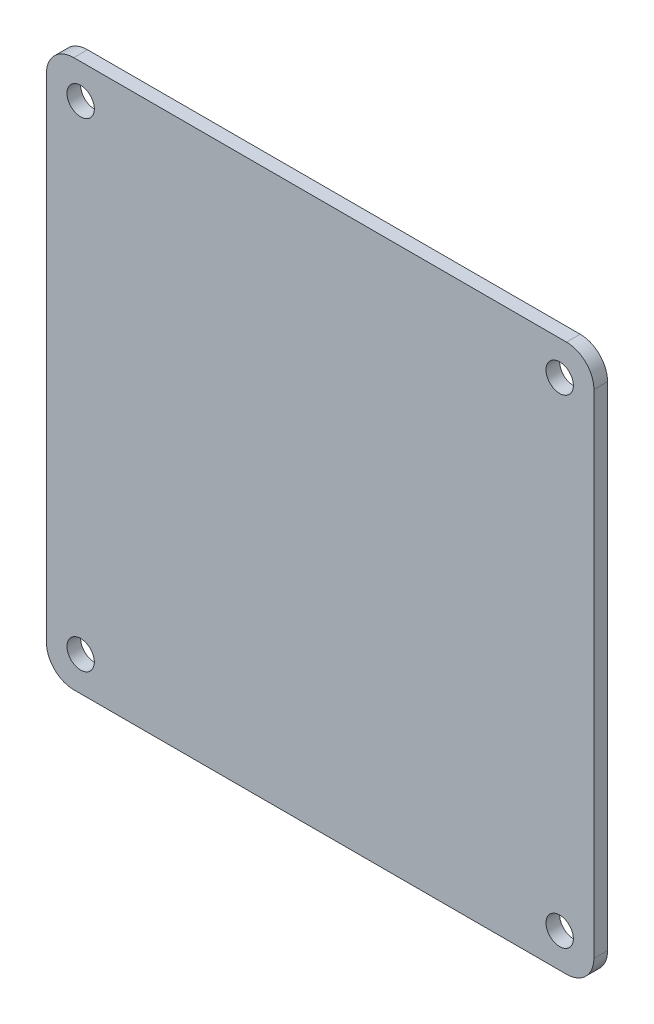
ISO-10303-21;
HEADER;
FILE_DESCRIPTION(('STEP AP214'),'2;1');
FILE_NAME('part.step','',(''),(''),'','','');
FILE_SCHEMA(('AUTOMOTIVE_DESIGN { 1 0 10303 214 1 1 1 1 }'));
ENDSEC;
DATA;
#1=APPLICATION_CONTEXT('core data for automotive mechanical design processes');
#2=APPLICATION_PROTOCOL_DEFINITION('international standard','automotive_design',2000,#1);
#3=PRODUCT_CONTEXT('',#1,'mechanical');
#4=PRODUCT('Part','Part','',(#3));
#5=PRODUCT_RELATED_PRODUCT_CATEGORY('part','',(#4));
#6=PRODUCT_DEFINITION_FORMATION('','',#4);
#7=PRODUCT_DEFINITION_CONTEXT('part definition',#1,'design');
#8=PRODUCT_DEFINITION('design','',#6,#7);
#9=PRODUCT_DEFINITION_SHAPE('','',#8);
#10=(LENGTH_UNIT() NAMED_UNIT(*) SI_UNIT(.MILLI.,.METRE.));
#11=(NAMED_UNIT(*) PLANE_ANGLE_UNIT() SI_UNIT($,.RADIAN.));
#12=(NAMED_UNIT(*) SI_UNIT($,.STERADIAN.) SOLID_ANGLE_UNIT());
#13=UNCERTAINTY_MEASURE_WITH_UNIT(LENGTH_MEASURE(1.E-05),#10,'distance_accuracy_value','');
#14=(GEOMETRIC_REPRESENTATION_CONTEXT(3) GLOBAL_UNCERTAINTY_ASSIGNED_CONTEXT((#13)) GLOBAL_UNIT_ASSIGNED_CONTEXT((#10,
#11,#12)) REPRESENTATION_CONTEXT('',''));
#15=CARTESIAN_POINT('',(0.,0.,0.));
#16=DIRECTION('',(0.,0.,1.));
#17=DIRECTION('',(1.,0.,0.));
#18=AXIS2_PLACEMENT_3D('',#15,#16,#17);
#19=CARTESIAN_POINT('',(-5.08,5.08,2.54));
#20=DIRECTION('',(0.,0.,-1.));
#21=DIRECTION('',(-1.,0.,0.));
#22=AXIS2_PLACEMENT_3D('',#19,#20,#21);
#23=CYLINDRICAL_SURFACE('',#22,5.08);
#24=CARTESIAN_POINT('',(-5.08,5.08,0.));
#25=DIRECTION('',(0.,0.,1.));
#26=DIRECTION('',(1.,0.,0.));
#27=AXIS2_PLACEMENT_3D('',#24,#25,#26);
#28=CIRCLE('',#27,5.08);
#29=CARTESIAN_POINT('',(-5.08000000000004,0.,0.));
#30=VERTEX_POINT('',#29);
#31=CARTESIAN_POINT('',(0.,5.08000000000004,0.));
#32=VERTEX_POINT('',#31);
#33=EDGE_CURVE('E129',#30,#32,#28,.T.);
#34=ORIENTED_EDGE('',*,*,#33,.T.);
#35=DIRECTION('',(0.,0.,-1.));
#36=VECTOR('',#35,1.);
#37=CARTESIAN_POINT('',(0.,5.08000000000004,2.54));
#38=LINE('',#37,#36);
#39=CARTESIAN_POINT('',(0.,5.08000000000004,2.54));
#40=VERTEX_POINT('',#39);
#41=EDGE_CURVE('E11',#40,#32,#38,.T.);
#42=ORIENTED_EDGE('',*,*,#41,.F.);
#43=CARTESIAN_POINT('',(-5.08,5.08,2.54));
#44=DIRECTION('',(0.,0.,1.));
#45=DIRECTION('',(1.,0.,0.));
#46=AXIS2_PLACEMENT_3D('',#43,#44,#45);
#47=CIRCLE('',#46,5.08);
#48=CARTESIAN_POINT('',(-5.08000000000004,0.,2.54));
#49=VERTEX_POINT('',#48);
#50=EDGE_CURVE('E144',#49,#40,#47,.T.);
#51=ORIENTED_EDGE('',*,*,#50,.F.);
#52=DIRECTION('',(0.,0.,-1.));
#53=VECTOR('',#52,1.);
#54=CARTESIAN_POINT('',(-5.08000000000004,0.,2.54));
#55=LINE('',#54,#53);
#56=EDGE_CURVE('E125',#49,#30,#55,.T.);
#57=ORIENTED_EDGE('',*,*,#56,.T.);
#58=EDGE_LOOP('',(#34,#42,#51,#57));
#59=FACE_BOUND('',#58,.T.);
#60=ADVANCED_FACE('F33',(#59),#23,.T.);
#61=CARTESIAN_POINT('',(0.,5.08000000000004,2.54));
#62=DIRECTION('',(-1.,0.,0.));
#63=DIRECTION('',(0.,0.,1.));
#64=AXIS2_PLACEMENT_3D('',#61,#62,#63);
#65=PLANE('',#64);
#66=DIRECTION('',(0.,1.,0.));
#67=VECTOR('',#66,1.);
#68=CARTESIAN_POINT('',(0.,5.08000000000004,0.));
#69=LINE('',#68,#67);
#70=CARTESIAN_POINT('',(0.,96.52,0.));
#71=VERTEX_POINT('',#70);
#72=EDGE_CURVE('E132',#32,#71,#69,.T.);
#73=ORIENTED_EDGE('',*,*,#72,.T.);
#74=DIRECTION('',(0.,0.,-1.));
#75=VECTOR('',#74,1.);
#76=CARTESIAN_POINT('',(0.,96.52,2.54));
#77=LINE('',#76,#75);
#78=CARTESIAN_POINT('',(0.,96.52,2.54));
#79=VERTEX_POINT('',#78);
#80=EDGE_CURVE('E41',#79,#71,#77,.T.);
#81=ORIENTED_EDGE('',*,*,#80,.F.);
#82=DIRECTION('',(0.,1.,0.));
#83=VECTOR('',#82,1.);
#84=CARTESIAN_POINT('',(0.,5.08000000000004,2.54));
#85=LINE('',#84,#83);
#86=EDGE_CURVE('E92',#40,#79,#85,.T.);
#87=ORIENTED_EDGE('',*,*,#86,.F.);
#88=ORIENTED_EDGE('',*,*,#41,.T.);
#89=EDGE_LOOP('',(#73,#81,#87,#88));
#90=FACE_BOUND('',#89,.T.);
#91=ADVANCED_FACE('F225',(#90),#65,.F.);
#92=CARTESIAN_POINT('',(-5.08,96.52,2.54));
#93=DIRECTION('',(0.,0.,-1.));
#94=DIRECTION('',(-1.,0.,0.));
#95=AXIS2_PLACEMENT_3D('',#92,#93,#94);
#96=CYLINDRICAL_SURFACE('',#95,5.08);
#97=CARTESIAN_POINT('',(-5.08,96.52,0.));
#98=DIRECTION('',(0.,0.,1.));
#99=DIRECTION('',(1.,0.,0.));
#100=AXIS2_PLACEMENT_3D('',#97,#98,#99);
#101=CIRCLE('',#100,5.08);
#102=CARTESIAN_POINT('',(-5.08000000000004,101.6,0.));
#103=VERTEX_POINT('',#102);
#104=EDGE_CURVE('E135',#71,#103,#101,.T.);
#105=ORIENTED_EDGE('',*,*,#104,.T.);
#106=DIRECTION('',(0.,0.,-1.));
#107=VECTOR('',#106,1.);
#108=CARTESIAN_POINT('',(-5.08000000000004,101.6,2.54));
#109=LINE('',#108,#107);
#110=CARTESIAN_POINT('',(-5.08000000000004,101.6,2.54));
#111=VERTEX_POINT('',#110);
#112=EDGE_CURVE('E151',#111,#103,#109,.T.);
#113=ORIENTED_EDGE('',*,*,#112,.F.);
#114=CARTESIAN_POINT('',(-5.08,96.52,2.54));
#115=DIRECTION('',(0.,0.,1.));
#116=DIRECTION('',(1.,0.,0.));
#117=AXIS2_PLACEMENT_3D('',#114,#115,#116);
#118=CIRCLE('',#117,5.08);
#119=EDGE_CURVE('E159',#79,#111,#118,.T.);
#120=ORIENTED_EDGE('',*,*,#119,.F.);
#121=ORIENTED_EDGE('',*,*,#80,.T.);
#122=EDGE_LOOP('',(#105,#113,#120,#121));
#123=FACE_BOUND('',#122,.T.);
#124=ADVANCED_FACE('F157',(#123),#96,.T.);
#125=CARTESIAN_POINT('',(-96.52,101.6,2.54));
#126=DIRECTION('',(0.,-1.,0.));
#127=DIRECTION('',(0.,0.,-1.));
#128=AXIS2_PLACEMENT_3D('',#125,#126,#127);
#129=PLANE('',#128);
#130=DIRECTION('',(-1.,0.,0.));
#131=VECTOR('',#130,1.);
#132=CARTESIAN_POINT('',(-96.52,101.6,0.));
#133=LINE('',#132,#131);
#134=CARTESIAN_POINT('',(-96.52,101.6,0.));
#135=VERTEX_POINT('',#134);
#136=EDGE_CURVE('E137',#103,#135,#133,.T.);
#137=ORIENTED_EDGE('',*,*,#136,.T.);
#138=DIRECTION('',(0.,0.,-1.));
#139=VECTOR('',#138,1.);
#140=CARTESIAN_POINT('',(-96.52,101.6,2.54));
#141=LINE('',#140,#139);
#142=CARTESIAN_POINT('',(-96.52,101.6,2.54));
#143=VERTEX_POINT('',#142);
#144=EDGE_CURVE('E148',#143,#135,#141,.T.);
#145=ORIENTED_EDGE('',*,*,#144,.F.);
#146=DIRECTION('',(-1.,0.,0.));
#147=VECTOR('',#146,1.);
#148=CARTESIAN_POINT('',(-96.52,101.6,2.54));
#149=LINE('',#148,#147);
#150=EDGE_CURVE('E171',#111,#143,#149,.T.);
#151=ORIENTED_EDGE('',*,*,#150,.F.);
#152=ORIENTED_EDGE('',*,*,#112,.T.);
#153=EDGE_LOOP('',(#137,#145,#151,#152));
#154=FACE_BOUND('',#153,.T.);
#155=ADVANCED_FACE('F167',(#154),#129,.F.);
#156=CARTESIAN_POINT('',(-96.52,96.52,2.54));
#157=DIRECTION('',(0.,0.,-1.));
#158=DIRECTION('',(-1.,0.,0.));
#159=AXIS2_PLACEMENT_3D('',#156,#157,#158);
#160=CYLINDRICAL_SURFACE('',#159,5.08);
#161=CARTESIAN_POINT('',(-96.52,96.52,0.));
#162=DIRECTION('',(0.,0.,1.));
#163=DIRECTION('',(1.,0.,0.));
#164=AXIS2_PLACEMENT_3D('',#161,#162,#163);
#165=CIRCLE('',#164,5.08);
#166=CARTESIAN_POINT('',(-101.6,96.52,0.));
#167=VERTEX_POINT('',#166);
#168=EDGE_CURVE('E139',#135,#167,#165,.T.);
#169=ORIENTED_EDGE('',*,*,#168,.T.);
#170=DIRECTION('',(0.,0.,-1.));
#171=VECTOR('',#170,1.);
#172=CARTESIAN_POINT('',(-101.6,96.52,2.54));
#173=LINE('',#172,#171);
#174=CARTESIAN_POINT('',(-101.6,96.52,2.54));
#175=VERTEX_POINT('',#174);
#176=EDGE_CURVE('E120',#175,#167,#173,.T.);
#177=ORIENTED_EDGE('',*,*,#176,.F.);
#178=CARTESIAN_POINT('',(-96.52,96.52,2.54));
#179=DIRECTION('',(0.,0.,1.));
#180=DIRECTION('',(1.,0.,0.));
#181=AXIS2_PLACEMENT_3D('',#178,#179,#180);
#182=CIRCLE('',#181,5.08);
#183=EDGE_CURVE('E111',#143,#175,#182,.T.);
#184=ORIENTED_EDGE('',*,*,#183,.F.);
#185=ORIENTED_EDGE('',*,*,#144,.T.);
#186=EDGE_LOOP('',(#169,#177,#184,#185));
#187=FACE_BOUND('',#186,.T.);
#188=ADVANCED_FACE('F170',(#187),#160,.T.);
#189=CARTESIAN_POINT('',(-101.6,5.08000000000004,2.54));
#190=DIRECTION('',(1.,0.,0.));
#191=DIRECTION('',(0.,0.,-1.));
#192=AXIS2_PLACEMENT_3D('',#189,#190,#191);
#193=PLANE('',#192);
#194=DIRECTION('',(0.,-1.,0.));
#195=VECTOR('',#194,1.);
#196=CARTESIAN_POINT('',(-101.6,5.08000000000004,0.));
#197=LINE('',#196,#195);
#198=CARTESIAN_POINT('',(-101.6,5.08,0.));
#199=VERTEX_POINT('',#198);
#200=EDGE_CURVE('E119',#167,#199,#197,.T.);
#201=ORIENTED_EDGE('',*,*,#200,.T.);
#202=DIRECTION('',(0.,0.,-1.));
#203=VECTOR('',#202,1.);
#204=CARTESIAN_POINT('',(-101.6,5.08,2.54));
#205=LINE('',#204,#203);
#206=CARTESIAN_POINT('',(-101.6,5.08,2.54));
#207=VERTEX_POINT('',#206);
#208=EDGE_CURVE('E116',#207,#199,#205,.T.);
#209=ORIENTED_EDGE('',*,*,#208,.F.);
#210=DIRECTION('',(0.,-1.,0.));
#211=VECTOR('',#210,1.);
#212=CARTESIAN_POINT('',(-101.6,5.08000000000004,2.54));
#213=LINE('',#212,#211);
#214=EDGE_CURVE('E105',#175,#207,#213,.T.);
#215=ORIENTED_EDGE('',*,*,#214,.F.);
#216=ORIENTED_EDGE('',*,*,#176,.T.);
#217=EDGE_LOOP('',(#201,#209,#215,#216));
#218=FACE_BOUND('',#217,.T.);
#219=ADVANCED_FACE('F117',(#218),#193,.F.);
#220=CARTESIAN_POINT('',(-96.52,5.08,2.54));
#221=DIRECTION('',(0.,0.,-1.));
#222=DIRECTION('',(-1.,0.,0.));
#223=AXIS2_PLACEMENT_3D('',#220,#221,#222);
#224=CYLINDRICAL_SURFACE('',#223,5.08);
#225=CARTESIAN_POINT('',(-96.52,5.08,0.));
#226=DIRECTION('',(0.,0.,1.));
#227=DIRECTION('',(-1.,0.,0.));
#228=AXIS2_PLACEMENT_3D('',#225,#226,#227);
#229=CIRCLE('',#228,5.08);
#230=CARTESIAN_POINT('',(-96.52,0.,0.));
#231=VERTEX_POINT('',#230);
#232=EDGE_CURVE('E78',#199,#231,#229,.T.);
#233=ORIENTED_EDGE('',*,*,#232,.T.);
#234=DIRECTION('',(0.,0.,-1.));
#235=VECTOR('',#234,1.);
#236=CARTESIAN_POINT('',(-96.52,0.,2.54));
#237=LINE('',#236,#235);
#238=CARTESIAN_POINT('',(-96.52,0.,2.54));
#239=VERTEX_POINT('',#238);
#240=EDGE_CURVE('E121',#239,#231,#237,.T.);
#241=ORIENTED_EDGE('',*,*,#240,.F.);
#242=CARTESIAN_POINT('',(-96.52,5.08,2.54));
#243=DIRECTION('',(0.,0.,1.));
#244=DIRECTION('',(-1.,0.,0.));
#245=AXIS2_PLACEMENT_3D('',#242,#243,#244);
#246=CIRCLE('',#245,5.08);
#247=EDGE_CURVE('E109',#207,#239,#246,.T.);
#248=ORIENTED_EDGE('',*,*,#247,.F.);
#249=ORIENTED_EDGE('',*,*,#208,.T.);
#250=EDGE_LOOP('',(#233,#241,#248,#249));
#251=FACE_BOUND('',#250,.T.);
#252=ADVANCED_FACE('F123',(#251),#224,.T.);
#253=CARTESIAN_POINT('',(-96.52,0.,2.54));
#254=DIRECTION('',(0.,1.,0.));
#255=DIRECTION('',(0.,0.,1.));
#256=AXIS2_PLACEMENT_3D('',#253,#254,#255);
#257=PLANE('',#256);
#258=DIRECTION('',(1.,0.,0.));
#259=VECTOR('',#258,1.);
#260=CARTESIAN_POINT('',(-96.52,0.,0.));
#261=LINE('',#260,#259);
#262=EDGE_CURVE('E84',#231,#30,#261,.T.);
#263=ORIENTED_EDGE('',*,*,#262,.T.);
#264=ORIENTED_EDGE('',*,*,#56,.F.);
#265=DIRECTION('',(1.,0.,0.));
#266=VECTOR('',#265,1.);
#267=CARTESIAN_POINT('',(-96.52,0.,2.54));
#268=LINE('',#267,#266);
#269=EDGE_CURVE('E49',#239,#49,#268,.T.);
#270=ORIENTED_EDGE('',*,*,#269,.F.);
#271=ORIENTED_EDGE('',*,*,#240,.T.);
#272=EDGE_LOOP('',(#263,#264,#270,#271));
#273=FACE_BOUND('',#272,.T.);
#274=ADVANCED_FACE('F206',(#273),#257,.F.);
#275=CARTESIAN_POINT('',(-5.08,5.08,2.54));
#276=DIRECTION('',(0.,0.,1.));
#277=DIRECTION('',(1.,0.,0.));
#278=AXIS2_PLACEMENT_3D('',#275,#276,#277);
#279=PLANE('',#278);
#280=CARTESIAN_POINT('',(-95.25,95.25,2.54));
#281=DIRECTION('',(0.,0.,1.));
#282=DIRECTION('',(-1.,0.,0.));
#283=AXIS2_PLACEMENT_3D('',#280,#281,#282);
#284=CIRCLE('',#283,2.53999999999999);
#285=CARTESIAN_POINT('',(-97.79,95.25,2.54));
#286=VERTEX_POINT('',#285);
#287=EDGE_CURVE('E186',#286,#286,#284,.T.);
#288=ORIENTED_EDGE('',*,*,#287,.F.);
#289=EDGE_LOOP('',(#288));
#290=FACE_BOUND('',#289,.T.);
#291=CARTESIAN_POINT('',(-6.35000000000005,95.25,2.54));
#292=DIRECTION('',(0.,0.,1.));
#293=DIRECTION('',(1.,0.,0.));
#294=AXIS2_PLACEMENT_3D('',#291,#292,#293);
#295=CIRCLE('',#294,2.53999999999999);
#296=CARTESIAN_POINT('',(-3.81000000000006,95.25,2.54));
#297=VERTEX_POINT('',#296);
#298=EDGE_CURVE('E192',#297,#297,#295,.T.);
#299=ORIENTED_EDGE('',*,*,#298,.F.);
#300=EDGE_LOOP('',(#299));
#301=FACE_BOUND('',#300,.T.);
#302=CARTESIAN_POINT('',(-6.34999999999999,6.35,2.54));
#303=DIRECTION('',(0.,0.,1.));
#304=DIRECTION('',(-1.,0.,0.));
#305=AXIS2_PLACEMENT_3D('',#302,#303,#304);
#306=CIRCLE('',#305,2.54);
#307=CARTESIAN_POINT('',(-8.88999999999999,6.35,2.54));
#308=VERTEX_POINT('',#307);
#309=EDGE_CURVE('E180',#308,#308,#306,.T.);
#310=ORIENTED_EDGE('',*,*,#309,.F.);
#311=EDGE_LOOP('',(#310));
#312=FACE_BOUND('',#311,.T.);
#313=CARTESIAN_POINT('',(-95.25,6.35,2.54));
#314=DIRECTION('',(0.,0.,1.));
#315=DIRECTION('',(1.,0.,0.));
#316=AXIS2_PLACEMENT_3D('',#313,#314,#315);
#317=CIRCLE('',#316,2.54);
#318=CARTESIAN_POINT('',(-92.71,6.35,2.54));
#319=VERTEX_POINT('',#318);
#320=EDGE_CURVE('E133',#319,#319,#317,.T.);
#321=ORIENTED_EDGE('',*,*,#320,.F.);
#322=EDGE_LOOP('',(#321));
#323=FACE_BOUND('',#322,.T.);
#324=ORIENTED_EDGE('',*,*,#50,.T.);
#325=ORIENTED_EDGE('',*,*,#86,.T.);
#326=ORIENTED_EDGE('',*,*,#119,.T.);
#327=ORIENTED_EDGE('',*,*,#150,.T.);
#328=ORIENTED_EDGE('',*,*,#183,.T.);
#329=ORIENTED_EDGE('',*,*,#214,.T.);
#330=ORIENTED_EDGE('',*,*,#247,.T.);
#331=ORIENTED_EDGE('',*,*,#269,.T.);
#332=EDGE_LOOP('',(#324,#325,#326,#327,#328,#329,#330,#331));
#333=FACE_BOUND('',#332,.T.);
#334=ADVANCED_FACE('F107',(#290,#301,#312,#323,#333),#279,.T.);
#335=CARTESIAN_POINT('',(-5.08,5.08,0.));
#336=DIRECTION('',(0.,0.,1.));
#337=DIRECTION('',(1.,0.,0.));
#338=AXIS2_PLACEMENT_3D('',#335,#336,#337);
#339=PLANE('',#338);
#340=CARTESIAN_POINT('',(-95.25,95.25,0.));
#341=DIRECTION('',(0.,0.,1.));
#342=DIRECTION('',(-1.,0.,0.));
#343=AXIS2_PLACEMENT_3D('',#340,#341,#342);
#344=CIRCLE('',#343,2.53999999999999);
#345=CARTESIAN_POINT('',(-97.79,95.25,0.));
#346=VERTEX_POINT('',#345);
#347=EDGE_CURVE('E183',#346,#346,#344,.T.);
#348=ORIENTED_EDGE('',*,*,#347,.T.);
#349=EDGE_LOOP('',(#348));
#350=FACE_BOUND('',#349,.T.);
#351=CARTESIAN_POINT('',(-6.35000000000005,95.25,0.));
#352=DIRECTION('',(0.,0.,1.));
#353=DIRECTION('',(1.,0.,0.));
#354=AXIS2_PLACEMENT_3D('',#351,#352,#353);
#355=CIRCLE('',#354,2.53999999999999);
#356=CARTESIAN_POINT('',(-3.81000000000006,95.25,0.));
#357=VERTEX_POINT('',#356);
#358=EDGE_CURVE('E189',#357,#357,#355,.T.);
#359=ORIENTED_EDGE('',*,*,#358,.T.);
#360=EDGE_LOOP('',(#359));
#361=FACE_BOUND('',#360,.T.);
#362=CARTESIAN_POINT('',(-6.34999999999999,6.35,0.));
#363=DIRECTION('',(0.,0.,1.));
#364=DIRECTION('',(-1.,0.,0.));
#365=AXIS2_PLACEMENT_3D('',#362,#363,#364);
#366=CIRCLE('',#365,2.54);
#367=CARTESIAN_POINT('',(-8.88999999999999,6.35,0.));
#368=VERTEX_POINT('',#367);
#369=EDGE_CURVE('E195',#368,#368,#366,.T.);
#370=ORIENTED_EDGE('',*,*,#369,.T.);
#371=EDGE_LOOP('',(#370));
#372=FACE_BOUND('',#371,.T.);
#373=CARTESIAN_POINT('',(-95.25,6.35,0.));
#374=DIRECTION('',(0.,0.,1.));
#375=DIRECTION('',(1.,0.,0.));
#376=AXIS2_PLACEMENT_3D('',#373,#374,#375);
#377=CIRCLE('',#376,2.54);
#378=CARTESIAN_POINT('',(-92.71,6.35,0.));
#379=VERTEX_POINT('',#378);
#380=EDGE_CURVE('E177',#379,#379,#377,.T.);
#381=ORIENTED_EDGE('',*,*,#380,.T.);
#382=EDGE_LOOP('',(#381));
#383=FACE_BOUND('',#382,.T.);
#384=ORIENTED_EDGE('',*,*,#33,.F.);
#385=ORIENTED_EDGE('',*,*,#262,.F.);
#386=ORIENTED_EDGE('',*,*,#232,.F.);
#387=ORIENTED_EDGE('',*,*,#200,.F.);
#388=ORIENTED_EDGE('',*,*,#168,.F.);
#389=ORIENTED_EDGE('',*,*,#136,.F.);
#390=ORIENTED_EDGE('',*,*,#104,.F.);
#391=ORIENTED_EDGE('',*,*,#72,.F.);
#392=EDGE_LOOP('',(#384,#385,#386,#387,#388,#389,#390,#391));
#393=FACE_BOUND('',#392,.T.);
#394=ADVANCED_FACE('F163',(#350,#361,#372,#383,#393),#339,.F.);
#395=CARTESIAN_POINT('',(-95.25,6.35,2.54));
#396=DIRECTION('',(0.,0.,-1.));
#397=DIRECTION('',(-1.,0.,0.));
#398=AXIS2_PLACEMENT_3D('',#395,#396,#397);
#399=CYLINDRICAL_SURFACE('',#398,2.54);
#400=ORIENTED_EDGE('',*,*,#320,.T.);
#401=EDGE_LOOP('',(#400));
#402=FACE_BOUND('',#401,.T.);
#403=ORIENTED_EDGE('',*,*,#380,.F.);
#404=EDGE_LOOP('',(#403));
#405=FACE_BOUND('',#404,.T.);
#406=ADVANCED_FACE('F211',(#402,#405),#399,.F.);
#407=CARTESIAN_POINT('',(-6.34999999999999,6.35,2.54));
#408=DIRECTION('',(0.,0.,-1.));
#409=DIRECTION('',(-1.,0.,0.));
#410=AXIS2_PLACEMENT_3D('',#407,#408,#409);
#411=CYLINDRICAL_SURFACE('',#410,2.54);
#412=ORIENTED_EDGE('',*,*,#309,.T.);
#413=EDGE_LOOP('',(#412));
#414=FACE_BOUND('',#413,.T.);
#415=ORIENTED_EDGE('',*,*,#369,.F.);
#416=EDGE_LOOP('',(#415));
#417=FACE_BOUND('',#416,.T.);
#418=ADVANCED_FACE('F201',(#414,#417),#411,.F.);
#419=CARTESIAN_POINT('',(-6.35000000000005,95.25,2.54));
#420=DIRECTION('',(0.,0.,-1.));
#421=DIRECTION('',(-1.,0.,0.));
#422=AXIS2_PLACEMENT_3D('',#419,#420,#421);
#423=CYLINDRICAL_SURFACE('',#422,2.53999999999999);
#424=ORIENTED_EDGE('',*,*,#298,.T.);
#425=EDGE_LOOP('',(#424));
#426=FACE_BOUND('',#425,.T.);
#427=ORIENTED_EDGE('',*,*,#358,.F.);
#428=EDGE_LOOP('',(#427));
#429=FACE_BOUND('',#428,.T.);
#430=ADVANCED_FACE('F294',(#426,#429),#423,.F.);
#431=CARTESIAN_POINT('',(-95.25,95.25,2.54));
#432=DIRECTION('',(0.,0.,-1.));
#433=DIRECTION('',(-1.,0.,0.));
#434=AXIS2_PLACEMENT_3D('',#431,#432,#433);
#435=CYLINDRICAL_SURFACE('',#434,2.53999999999999);
#436=ORIENTED_EDGE('',*,*,#287,.T.);
#437=EDGE_LOOP('',(#436));
#438=FACE_BOUND('',#437,.T.);
#439=ORIENTED_EDGE('',*,*,#347,.F.);
#440=EDGE_LOOP('',(#439));
#441=FACE_BOUND('',#440,.T.);
#442=ADVANCED_FACE('F303',(#438,#441),#435,.F.);
#443=CLOSED_SHELL('',(#60,#91,#124,#155,#188,#219,#252,#274,#334,#394,#406,#418,#430,#442));
#444=MANIFOLD_SOLID_BREP('B2',#443);
#445=ADVANCED_BREP_SHAPE_REPRESENTATION('',(#18,#444),#14);
#446=SHAPE_DEFINITION_REPRESENTATION(#9,#445);
ENDSEC;
END-ISO-10303-21;
